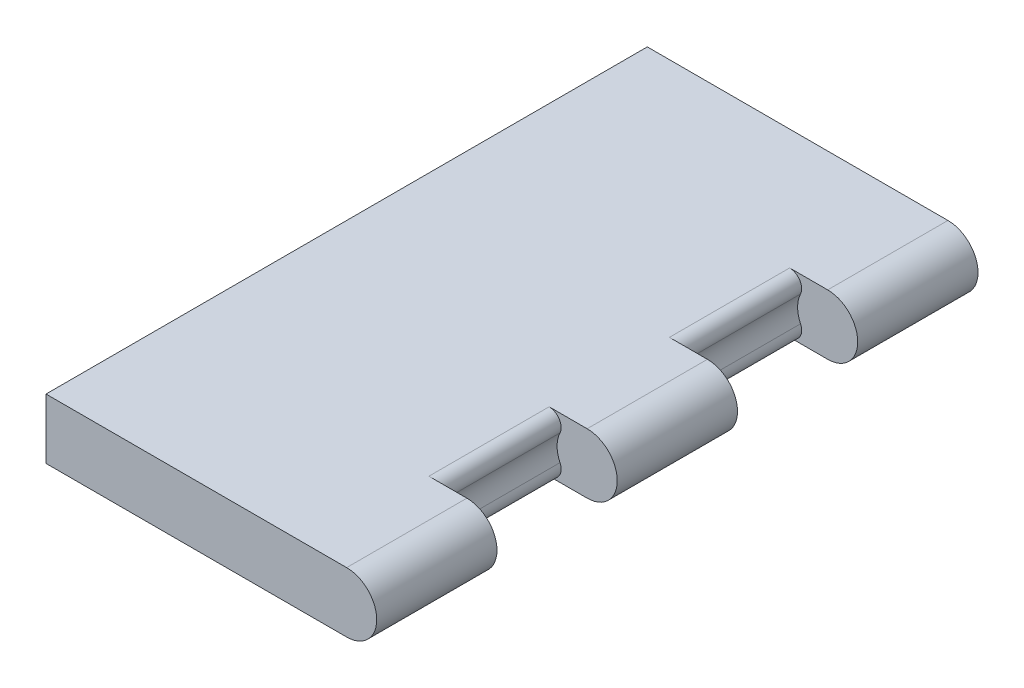
ISO-10303-21;
HEADER;
FILE_DESCRIPTION(('STEP AP214'),'2;1');
FILE_NAME('part.step','',(''),(''),'','','');
FILE_SCHEMA(('AUTOMOTIVE_DESIGN { 1 0 10303 214 1 1 1 1 }'));
ENDSEC;
DATA;
#1=APPLICATION_CONTEXT('core data for automotive mechanical design processes');
#2=APPLICATION_PROTOCOL_DEFINITION('international standard','automotive_design',2000,#1);
#3=PRODUCT_CONTEXT('',#1,'mechanical');
#4=PRODUCT('Part','Part','',(#3));
#5=PRODUCT_RELATED_PRODUCT_CATEGORY('part','',(#4));
#6=PRODUCT_DEFINITION_FORMATION('','',#4);
#7=PRODUCT_DEFINITION_CONTEXT('part definition',#1,'design');
#8=PRODUCT_DEFINITION('design','',#6,#7);
#9=PRODUCT_DEFINITION_SHAPE('','',#8);
#10=(LENGTH_UNIT() NAMED_UNIT(*) SI_UNIT(.MILLI.,.METRE.));
#11=(NAMED_UNIT(*) PLANE_ANGLE_UNIT() SI_UNIT($,.RADIAN.));
#12=(NAMED_UNIT(*) SI_UNIT($,.STERADIAN.) SOLID_ANGLE_UNIT());
#13=UNCERTAINTY_MEASURE_WITH_UNIT(LENGTH_MEASURE(1.E-05),#10,'distance_accuracy_value','');
#14=(GEOMETRIC_REPRESENTATION_CONTEXT(3) GLOBAL_UNCERTAINTY_ASSIGNED_CONTEXT((#13)) GLOBAL_UNIT_ASSIGNED_CONTEXT((#10,
#11,#12)) REPRESENTATION_CONTEXT('',''));
#15=CARTESIAN_POINT('',(0.,0.,0.));
#16=DIRECTION('',(0.,0.,1.));
#17=DIRECTION('',(1.,0.,0.));
#18=AXIS2_PLACEMENT_3D('',#15,#16,#17);
#19=CARTESIAN_POINT('',(50.,5.00000000000003,100.));
#20=DIRECTION('',(0.,0.,-1.));
#21=DIRECTION('',(-1.,0.,0.));
#22=AXIS2_PLACEMENT_3D('',#19,#20,#21);
#23=CYLINDRICAL_SURFACE('',#22,5.);
#24=CARTESIAN_POINT('',(50.,5.00000000000003,80.));
#25=DIRECTION('',(0.,0.,-1.));
#26=DIRECTION('',(-1.,0.,0.));
#27=AXIS2_PLACEMENT_3D('',#24,#25,#26);
#28=CIRCLE('',#27,5.);
#29=CARTESIAN_POINT('',(50.,0.,80.));
#30=VERTEX_POINT('',#29);
#31=CARTESIAN_POINT('',(50.,10.,80.));
#32=VERTEX_POINT('',#31);
#33=EDGE_CURVE('E263',#30,#32,#28,.F.);
#34=ORIENTED_EDGE('',*,*,#33,.T.);
#35=DIRECTION('',(0.,0.,-1.));
#36=VECTOR('',#35,1.);
#37=CARTESIAN_POINT('',(50.,10.,100.));
#38=LINE('',#37,#36);
#39=CARTESIAN_POINT('',(50.,10.,100.));
#40=VERTEX_POINT('',#39);
#41=EDGE_CURVE('E193',#40,#32,#38,.T.);
#42=ORIENTED_EDGE('',*,*,#41,.F.);
#43=CARTESIAN_POINT('',(50.,5.00000000000003,100.));
#44=DIRECTION('',(0.,0.,1.));
#45=DIRECTION('',(1.,0.,0.));
#46=AXIS2_PLACEMENT_3D('',#43,#44,#45);
#47=CIRCLE('',#46,5.);
#48=CARTESIAN_POINT('',(50.,0.,100.));
#49=VERTEX_POINT('',#48);
#50=EDGE_CURVE('E202',#49,#40,#47,.T.);
#51=ORIENTED_EDGE('',*,*,#50,.F.);
#52=DIRECTION('',(0.,0.,-1.));
#53=VECTOR('',#52,1.);
#54=CARTESIAN_POINT('',(50.,0.,100.));
#55=LINE('',#54,#53);
#56=EDGE_CURVE('E292',#49,#30,#55,.T.);
#57=ORIENTED_EDGE('',*,*,#56,.T.);
#58=EDGE_LOOP('',(#34,#42,#51,#57));
#59=FACE_BOUND('',#58,.T.);
#60=ADVANCED_FACE('F54',(#59),#23,.T.);
#61=CARTESIAN_POINT('',(50.,10.,60.));
#62=VERTEX_POINT('',#61);
#63=CARTESIAN_POINT('',(50.,10.,40.));
#64=VERTEX_POINT('',#63);
#65=EDGE_CURVE('E172',#62,#64,#38,.T.);
#66=ORIENTED_EDGE('',*,*,#65,.F.);
#67=CARTESIAN_POINT('',(50.,5.00000000000003,60.));
#68=DIRECTION('',(0.,0.,-1.));
#69=DIRECTION('',(-1.,0.,0.));
#70=AXIS2_PLACEMENT_3D('',#67,#68,#69);
#71=CIRCLE('',#70,5.);
#72=CARTESIAN_POINT('',(50.,0.,60.));
#73=VERTEX_POINT('',#72);
#74=EDGE_CURVE('E181',#62,#73,#71,.T.);
#75=ORIENTED_EDGE('',*,*,#74,.T.);
#76=CARTESIAN_POINT('',(50.,0.,40.));
#77=VERTEX_POINT('',#76);
#78=EDGE_CURVE('E295',#73,#77,#55,.T.);
#79=ORIENTED_EDGE('',*,*,#78,.T.);
#80=CARTESIAN_POINT('',(50.,5.00000000000003,40.));
#81=DIRECTION('',(0.,0.,-1.));
#82=DIRECTION('',(-1.,0.,0.));
#83=AXIS2_PLACEMENT_3D('',#80,#81,#82);
#84=CIRCLE('',#83,5.);
#85=EDGE_CURVE('E192',#77,#64,#84,.F.);
#86=ORIENTED_EDGE('',*,*,#85,.T.);
#87=EDGE_LOOP('',(#66,#75,#79,#86));
#88=FACE_BOUND('',#87,.T.);
#89=ADVANCED_FACE('F191',(#88),#23,.T.);
#90=CARTESIAN_POINT('',(0.,10.,100.));
#91=DIRECTION('',(0.,1.,0.));
#92=DIRECTION('',(-1.,0.,0.));
#93=AXIS2_PLACEMENT_3D('',#90,#91,#92);
#94=PLANE('',#93);
#95=DIRECTION('',(0.,0.,1.));
#96=VECTOR('',#95,1.);
#97=CARTESIAN_POINT('',(43.6754446796632,10.,60.));
#98=LINE('',#97,#96);
#99=CARTESIAN_POINT('',(43.6754446796632,10.,80.));
#100=VERTEX_POINT('',#99);
#101=CARTESIAN_POINT('',(43.6754446796632,10.,60.));
#102=VERTEX_POINT('',#101);
#103=EDGE_CURVE('E176',#100,#102,#98,.F.);
#104=ORIENTED_EDGE('',*,*,#103,.T.);
#105=DIRECTION('',(1.,0.,0.));
#106=VECTOR('',#105,1.);
#107=CARTESIAN_POINT('',(50.,10.,60.));
#108=LINE('',#107,#106);
#109=EDGE_CURVE('E168',#102,#62,#108,.T.);
#110=ORIENTED_EDGE('',*,*,#109,.T.);
#111=ORIENTED_EDGE('',*,*,#65,.T.);
#112=DIRECTION('',(-1.,0.,0.));
#113=VECTOR('',#112,1.);
#114=CARTESIAN_POINT('',(0.,10.,40.));
#115=LINE('',#114,#113);
#116=CARTESIAN_POINT('',(43.6754446796632,10.,40.));
#117=VERTEX_POINT('',#116);
#118=EDGE_CURVE('E68',#64,#117,#115,.T.);
#119=ORIENTED_EDGE('',*,*,#118,.T.);
#120=DIRECTION('',(0.,0.,1.));
#121=VECTOR('',#120,1.);
#122=CARTESIAN_POINT('',(43.6754446796632,10.,20.));
#123=LINE('',#122,#121);
#124=CARTESIAN_POINT('',(43.6754446796632,10.,20.));
#125=VERTEX_POINT('',#124);
#126=EDGE_CURVE('E226',#117,#125,#123,.F.);
#127=ORIENTED_EDGE('',*,*,#126,.T.);
#128=DIRECTION('',(1.,0.,0.));
#129=VECTOR('',#128,1.);
#130=CARTESIAN_POINT('',(50.,10.,20.));
#131=LINE('',#130,#129);
#132=CARTESIAN_POINT('',(50.,10.,20.));
#133=VERTEX_POINT('',#132);
#134=EDGE_CURVE('E229',#125,#133,#131,.T.);
#135=ORIENTED_EDGE('',*,*,#134,.T.);
#136=CARTESIAN_POINT('',(50.,10.,0.));
#137=VERTEX_POINT('',#136);
#138=EDGE_CURVE('E194',#133,#137,#38,.T.);
#139=ORIENTED_EDGE('',*,*,#138,.T.);
#140=DIRECTION('',(1.,0.,0.));
#141=VECTOR('',#140,1.);
#142=CARTESIAN_POINT('',(0.,10.,0.));
#143=LINE('',#142,#141);
#144=CARTESIAN_POINT('',(0.,10.,0.));
#145=VERTEX_POINT('',#144);
#146=EDGE_CURVE('E205',#145,#137,#143,.T.);
#147=ORIENTED_EDGE('',*,*,#146,.F.);
#148=DIRECTION('',(0.,0.,-1.));
#149=VECTOR('',#148,1.);
#150=CARTESIAN_POINT('',(0.,10.,100.));
#151=LINE('',#150,#149);
#152=CARTESIAN_POINT('',(0.,10.,100.));
#153=VERTEX_POINT('',#152);
#154=EDGE_CURVE('E198',#153,#145,#151,.T.);
#155=ORIENTED_EDGE('',*,*,#154,.F.);
#156=DIRECTION('',(1.,0.,0.));
#157=VECTOR('',#156,1.);
#158=CARTESIAN_POINT('',(0.,10.,100.));
#159=LINE('',#158,#157);
#160=EDGE_CURVE('E291',#153,#40,#159,.T.);
#161=ORIENTED_EDGE('',*,*,#160,.T.);
#162=ORIENTED_EDGE('',*,*,#41,.T.);
#163=DIRECTION('',(-1.,0.,0.));
#164=VECTOR('',#163,1.);
#165=CARTESIAN_POINT('',(0.,10.,80.));
#166=LINE('',#165,#164);
#167=EDGE_CURVE('E231',#32,#100,#166,.T.);
#168=ORIENTED_EDGE('',*,*,#167,.T.);
#169=EDGE_LOOP('',(#104,#110,#111,#119,#127,#135,#139,#147,#155,#161,#162,#168));
#170=FACE_BOUND('',#169,.T.);
#171=ADVANCED_FACE('F170',(#170),#94,.T.);
#172=CARTESIAN_POINT('',(0.,0.,100.));
#173=DIRECTION('',(-1.,0.,0.));
#174=DIRECTION('',(0.,-1.,0.));
#175=AXIS2_PLACEMENT_3D('',#172,#173,#174);
#176=PLANE('',#175);
#177=DIRECTION('',(0.,1.,0.));
#178=VECTOR('',#177,1.);
#179=CARTESIAN_POINT('',(0.,0.,0.));
#180=LINE('',#179,#178);
#181=CARTESIAN_POINT('',(0.,0.,0.));
#182=VERTEX_POINT('',#181);
#183=EDGE_CURVE('E282',#182,#145,#180,.T.);
#184=ORIENTED_EDGE('',*,*,#183,.F.);
#185=DIRECTION('',(0.,0.,-1.));
#186=VECTOR('',#185,1.);
#187=CARTESIAN_POINT('',(0.,0.,100.));
#188=LINE('',#187,#186);
#189=CARTESIAN_POINT('',(0.,0.,100.));
#190=VERTEX_POINT('',#189);
#191=EDGE_CURVE('E294',#190,#182,#188,.T.);
#192=ORIENTED_EDGE('',*,*,#191,.F.);
#193=DIRECTION('',(0.,1.,0.));
#194=VECTOR('',#193,1.);
#195=CARTESIAN_POINT('',(0.,0.,100.));
#196=LINE('',#195,#194);
#197=EDGE_CURVE('E302',#190,#153,#196,.T.);
#198=ORIENTED_EDGE('',*,*,#197,.T.);
#199=ORIENTED_EDGE('',*,*,#154,.T.);
#200=EDGE_LOOP('',(#184,#192,#198,#199));
#201=FACE_BOUND('',#200,.T.);
#202=ADVANCED_FACE('F300',(#201),#176,.T.);
#203=CARTESIAN_POINT('',(0.,0.,100.));
#204=DIRECTION('',(0.,1.,0.));
#205=DIRECTION('',(-1.,0.,0.));
#206=AXIS2_PLACEMENT_3D('',#203,#204,#205);
#207=PLANE('',#206);
#208=ORIENTED_EDGE('',*,*,#78,.F.);
#209=DIRECTION('',(-1.,0.,0.));
#210=VECTOR('',#209,1.);
#211=CARTESIAN_POINT('',(0.,0.,60.));
#212=LINE('',#211,#210);
#213=CARTESIAN_POINT('',(43.6754446796633,0.,60.));
#214=VERTEX_POINT('',#213);
#215=EDGE_CURVE('E184',#73,#214,#212,.T.);
#216=ORIENTED_EDGE('',*,*,#215,.T.);
#217=DIRECTION('',(0.,0.,-1.));
#218=VECTOR('',#217,1.);
#219=CARTESIAN_POINT('',(43.6754446796633,0.,100.));
#220=LINE('',#219,#218);
#221=CARTESIAN_POINT('',(43.6754446796633,0.,80.));
#222=VERTEX_POINT('',#221);
#223=EDGE_CURVE('E221',#214,#222,#220,.F.);
#224=ORIENTED_EDGE('',*,*,#223,.T.);
#225=DIRECTION('',(1.,0.,0.));
#226=VECTOR('',#225,1.);
#227=CARTESIAN_POINT('',(0.,0.,80.));
#228=LINE('',#227,#226);
#229=EDGE_CURVE('E219',#222,#30,#228,.T.);
#230=ORIENTED_EDGE('',*,*,#229,.T.);
#231=ORIENTED_EDGE('',*,*,#56,.F.);
#232=DIRECTION('',(1.,0.,0.));
#233=VECTOR('',#232,1.);
#234=CARTESIAN_POINT('',(0.,0.,100.));
#235=LINE('',#234,#233);
#236=EDGE_CURVE('E287',#190,#49,#235,.T.);
#237=ORIENTED_EDGE('',*,*,#236,.F.);
#238=ORIENTED_EDGE('',*,*,#191,.T.);
#239=DIRECTION('',(1.,0.,0.));
#240=VECTOR('',#239,1.);
#241=CARTESIAN_POINT('',(0.,0.,0.));
#242=LINE('',#241,#240);
#243=CARTESIAN_POINT('',(50.,0.,0.));
#244=VERTEX_POINT('',#243);
#245=EDGE_CURVE('E284',#182,#244,#242,.T.);
#246=ORIENTED_EDGE('',*,*,#245,.T.);
#247=CARTESIAN_POINT('',(50.,0.,20.));
#248=VERTEX_POINT('',#247);
#249=EDGE_CURVE('E275',#248,#244,#55,.T.);
#250=ORIENTED_EDGE('',*,*,#249,.F.);
#251=DIRECTION('',(-1.,0.,0.));
#252=VECTOR('',#251,1.);
#253=CARTESIAN_POINT('',(0.,0.,20.));
#254=LINE('',#253,#252);
#255=CARTESIAN_POINT('',(43.6754446796633,0.,20.));
#256=VERTEX_POINT('',#255);
#257=EDGE_CURVE('E76',#248,#256,#254,.T.);
#258=ORIENTED_EDGE('',*,*,#257,.T.);
#259=DIRECTION('',(0.,0.,-1.));
#260=VECTOR('',#259,1.);
#261=CARTESIAN_POINT('',(43.6754446796633,0.,100.));
#262=LINE('',#261,#260);
#263=CARTESIAN_POINT('',(43.6754446796633,0.,40.));
#264=VERTEX_POINT('',#263);
#265=EDGE_CURVE('E215',#256,#264,#262,.F.);
#266=ORIENTED_EDGE('',*,*,#265,.T.);
#267=DIRECTION('',(1.,0.,0.));
#268=VECTOR('',#267,1.);
#269=CARTESIAN_POINT('',(0.,0.,40.));
#270=LINE('',#269,#268);
#271=EDGE_CURVE('E213',#264,#77,#270,.T.);
#272=ORIENTED_EDGE('',*,*,#271,.T.);
#273=EDGE_LOOP('',(#208,#216,#224,#230,#231,#237,#238,#246,#250,#258,#266,#272));
#274=FACE_BOUND('',#273,.T.);
#275=ADVANCED_FACE('F329',(#274),#207,.F.);
#276=CARTESIAN_POINT('',(0.,0.,0.));
#277=DIRECTION('',(0.,0.,1.));
#278=DIRECTION('',(1.,0.,0.));
#279=AXIS2_PLACEMENT_3D('',#276,#277,#278);
#280=PLANE('',#279);
#281=ORIENTED_EDGE('',*,*,#146,.T.);
#282=CARTESIAN_POINT('',(50.,5.00000000000003,0.));
#283=DIRECTION('',(0.,0.,1.));
#284=DIRECTION('',(1.,0.,0.));
#285=AXIS2_PLACEMENT_3D('',#282,#283,#284);
#286=CIRCLE('',#285,5.);
#287=EDGE_CURVE('E206',#244,#137,#286,.T.);
#288=ORIENTED_EDGE('',*,*,#287,.F.);
#289=ORIENTED_EDGE('',*,*,#245,.F.);
#290=ORIENTED_EDGE('',*,*,#183,.T.);
#291=EDGE_LOOP('',(#281,#288,#289,#290));
#292=FACE_BOUND('',#291,.T.);
#293=ADVANCED_FACE('F280',(#292),#280,.F.);
#294=CARTESIAN_POINT('',(0.,0.,100.));
#295=DIRECTION('',(0.,0.,1.));
#296=DIRECTION('',(1.,0.,0.));
#297=AXIS2_PLACEMENT_3D('',#294,#295,#296);
#298=PLANE('',#297);
#299=ORIENTED_EDGE('',*,*,#236,.T.);
#300=ORIENTED_EDGE('',*,*,#50,.T.);
#301=ORIENTED_EDGE('',*,*,#160,.F.);
#302=ORIENTED_EDGE('',*,*,#197,.F.);
#303=EDGE_LOOP('',(#299,#300,#301,#302));
#304=FACE_BOUND('',#303,.T.);
#305=ADVANCED_FACE('F307',(#304),#298,.T.);
#306=ORIENTED_EDGE('',*,*,#138,.F.);
#307=CARTESIAN_POINT('',(50.,5.00000000000003,20.));
#308=DIRECTION('',(0.,0.,-1.));
#309=DIRECTION('',(-1.,0.,0.));
#310=AXIS2_PLACEMENT_3D('',#307,#308,#309);
#311=CIRCLE('',#310,5.);
#312=EDGE_CURVE('E262',#133,#248,#311,.T.);
#313=ORIENTED_EDGE('',*,*,#312,.T.);
#314=ORIENTED_EDGE('',*,*,#249,.T.);
#315=ORIENTED_EDGE('',*,*,#287,.T.);
#316=EDGE_LOOP('',(#306,#313,#314,#315));
#317=FACE_BOUND('',#316,.T.);
#318=ADVANCED_FACE('F272',(#317),#23,.T.);
#319=CARTESIAN_POINT('',(50.,5.00000000000003,54.142135623731));
#320=DIRECTION('',(0.,0.,-1.));
#321=DIRECTION('',(-1.,0.,0.));
#322=AXIS2_PLACEMENT_3D('',#319,#320,#321);
#323=CYLINDRICAL_SURFACE('',#322,5.);
#324=CARTESIAN_POINT('',(45.4824604854737,7.14285714285717,40.));
#325=VERTEX_POINT('',#324);
#326=CARTESIAN_POINT('',(45.4824604854738,2.85714285714288,40.));
#327=VERTEX_POINT('',#326);
#328=EDGE_CURVE('E267',#325,#327,#84,.F.);
#329=ORIENTED_EDGE('',*,*,#328,.T.);
#330=DIRECTION('',(0.,0.,-1.));
#331=VECTOR('',#330,1.);
#332=CARTESIAN_POINT('',(45.4824604854738,2.85714285714288,54.142135623731));
#333=LINE('',#332,#331);
#334=CARTESIAN_POINT('',(45.4824604854738,2.85714285714288,20.));
#335=VERTEX_POINT('',#334);
#336=EDGE_CURVE('E235',#327,#335,#333,.T.);
#337=ORIENTED_EDGE('',*,*,#336,.T.);
#338=CARTESIAN_POINT('',(45.4824604854737,7.14285714285717,20.));
#339=VERTEX_POINT('',#338);
#340=EDGE_CURVE('E253',#335,#339,#311,.T.);
#341=ORIENTED_EDGE('',*,*,#340,.T.);
#342=DIRECTION('',(0.,0.,-1.));
#343=VECTOR('',#342,1.);
#344=CARTESIAN_POINT('',(45.4824604854737,7.14285714285717,54.142135623731));
#345=LINE('',#344,#343);
#346=EDGE_CURVE('E178',#339,#325,#345,.F.);
#347=ORIENTED_EDGE('',*,*,#346,.T.);
#348=EDGE_LOOP('',(#329,#337,#341,#347));
#349=FACE_BOUND('',#348,.T.);
#350=ADVANCED_FACE('F259',(#349),#323,.F.);
#351=CARTESIAN_POINT('',(50.,5.00000000000003,20.));
#352=DIRECTION('',(0.,0.,-1.));
#353=DIRECTION('',(-1.,0.,0.));
#354=AXIS2_PLACEMENT_3D('',#351,#352,#353);
#355=PLANE('',#354);
#356=ORIENTED_EDGE('',*,*,#312,.F.);
#357=ORIENTED_EDGE('',*,*,#134,.F.);
#358=CARTESIAN_POINT('',(43.6754446796632,8.00000000000003,20.));
#359=DIRECTION('',(0.,0.,-1.));
#360=DIRECTION('',(-1.,0.,0.));
#361=AXIS2_PLACEMENT_3D('',#358,#359,#360);
#362=CIRCLE('',#361,2.);
#363=EDGE_CURVE('E62',#125,#339,#362,.T.);
#364=ORIENTED_EDGE('',*,*,#363,.T.);
#365=ORIENTED_EDGE('',*,*,#340,.F.);
#366=CARTESIAN_POINT('',(43.6754446796633,2.00000000000002,20.));
#367=DIRECTION('',(0.,0.,-1.));
#368=DIRECTION('',(-1.,0.,0.));
#369=AXIS2_PLACEMENT_3D('',#366,#367,#368);
#370=CIRCLE('',#369,2.);
#371=EDGE_CURVE('E246',#335,#256,#370,.T.);
#372=ORIENTED_EDGE('',*,*,#371,.T.);
#373=ORIENTED_EDGE('',*,*,#257,.F.);
#374=EDGE_LOOP('',(#356,#357,#364,#365,#372,#373));
#375=FACE_BOUND('',#374,.T.);
#376=ADVANCED_FACE('F252',(#375),#355,.F.);
#377=CARTESIAN_POINT('',(0.,0.,40.));
#378=DIRECTION('',(0.,0.,-1.));
#379=DIRECTION('',(-1.,0.,0.));
#380=AXIS2_PLACEMENT_3D('',#377,#378,#379);
#381=PLANE('',#380);
#382=ORIENTED_EDGE('',*,*,#85,.F.);
#383=ORIENTED_EDGE('',*,*,#271,.F.);
#384=CARTESIAN_POINT('',(43.6754446796633,2.00000000000002,40.));
#385=DIRECTION('',(0.,0.,-1.));
#386=DIRECTION('',(-1.,0.,0.));
#387=AXIS2_PLACEMENT_3D('',#384,#385,#386);
#388=CIRCLE('',#387,2.);
#389=EDGE_CURVE('E248',#264,#327,#388,.F.);
#390=ORIENTED_EDGE('',*,*,#389,.T.);
#391=ORIENTED_EDGE('',*,*,#328,.F.);
#392=CARTESIAN_POINT('',(43.6754446796632,8.00000000000003,40.));
#393=DIRECTION('',(0.,0.,-1.));
#394=DIRECTION('',(-1.,0.,0.));
#395=AXIS2_PLACEMENT_3D('',#392,#393,#394);
#396=CIRCLE('',#395,2.);
#397=EDGE_CURVE('E12',#325,#117,#396,.F.);
#398=ORIENTED_EDGE('',*,*,#397,.T.);
#399=ORIENTED_EDGE('',*,*,#118,.F.);
#400=EDGE_LOOP('',(#382,#383,#390,#391,#398,#399));
#401=FACE_BOUND('',#400,.T.);
#402=ADVANCED_FACE('F266',(#401),#381,.T.);
#403=CARTESIAN_POINT('',(50.,5.00000000000003,94.1421356237309));
#404=DIRECTION('',(0.,0.,-1.));
#405=DIRECTION('',(-1.,0.,0.));
#406=AXIS2_PLACEMENT_3D('',#403,#404,#405);
#407=CYLINDRICAL_SURFACE('',#406,5.);
#408=CARTESIAN_POINT('',(45.4824604854737,7.14285714285717,80.));
#409=VERTEX_POINT('',#408);
#410=CARTESIAN_POINT('',(45.4824604854738,2.85714285714288,80.));
#411=VERTEX_POINT('',#410);
#412=EDGE_CURVE('E188',#409,#411,#28,.F.);
#413=ORIENTED_EDGE('',*,*,#412,.T.);
#414=DIRECTION('',(0.,0.,-1.));
#415=VECTOR('',#414,1.);
#416=CARTESIAN_POINT('',(45.4824604854738,2.85714285714288,94.1421356237309));
#417=LINE('',#416,#415);
#418=CARTESIAN_POINT('',(45.4824604854738,2.85714285714288,60.));
#419=VERTEX_POINT('',#418);
#420=EDGE_CURVE('E210',#411,#419,#417,.T.);
#421=ORIENTED_EDGE('',*,*,#420,.T.);
#422=CARTESIAN_POINT('',(45.4824604854737,7.14285714285717,60.));
#423=VERTEX_POINT('',#422);
#424=EDGE_CURVE('E189',#419,#423,#71,.T.);
#425=ORIENTED_EDGE('',*,*,#424,.T.);
#426=DIRECTION('',(0.,0.,-1.));
#427=VECTOR('',#426,1.);
#428=CARTESIAN_POINT('',(45.4824604854737,7.14285714285717,94.1421356237309));
#429=LINE('',#428,#427);
#430=EDGE_CURVE('E197',#423,#409,#429,.F.);
#431=ORIENTED_EDGE('',*,*,#430,.T.);
#432=EDGE_LOOP('',(#413,#421,#425,#431));
#433=FACE_BOUND('',#432,.T.);
#434=ADVANCED_FACE('F319',(#433),#407,.F.);
#435=CARTESIAN_POINT('',(50.,5.00000000000003,60.));
#436=DIRECTION('',(0.,0.,-1.));
#437=DIRECTION('',(-1.,0.,0.));
#438=AXIS2_PLACEMENT_3D('',#435,#436,#437);
#439=PLANE('',#438);
#440=ORIENTED_EDGE('',*,*,#74,.F.);
#441=ORIENTED_EDGE('',*,*,#109,.F.);
#442=CARTESIAN_POINT('',(43.6754446796632,8.00000000000003,60.));
#443=DIRECTION('',(0.,0.,-1.));
#444=DIRECTION('',(-1.,0.,0.));
#445=AXIS2_PLACEMENT_3D('',#442,#443,#444);
#446=CIRCLE('',#445,2.);
#447=EDGE_CURVE('E242',#102,#423,#446,.T.);
#448=ORIENTED_EDGE('',*,*,#447,.T.);
#449=ORIENTED_EDGE('',*,*,#424,.F.);
#450=CARTESIAN_POINT('',(43.6754446796633,2.00000000000002,60.));
#451=DIRECTION('',(0.,0.,-1.));
#452=DIRECTION('',(-1.,0.,0.));
#453=AXIS2_PLACEMENT_3D('',#450,#451,#452);
#454=CIRCLE('',#453,2.);
#455=EDGE_CURVE('E238',#419,#214,#454,.T.);
#456=ORIENTED_EDGE('',*,*,#455,.T.);
#457=ORIENTED_EDGE('',*,*,#215,.F.);
#458=EDGE_LOOP('',(#440,#441,#448,#449,#456,#457));
#459=FACE_BOUND('',#458,.T.);
#460=ADVANCED_FACE('F182',(#459),#439,.F.);
#461=CARTESIAN_POINT('',(0.,0.,80.));
#462=DIRECTION('',(0.,0.,-1.));
#463=DIRECTION('',(-1.,0.,0.));
#464=AXIS2_PLACEMENT_3D('',#461,#462,#463);
#465=PLANE('',#464);
#466=ORIENTED_EDGE('',*,*,#33,.F.);
#467=ORIENTED_EDGE('',*,*,#229,.F.);
#468=CARTESIAN_POINT('',(43.6754446796633,2.00000000000002,80.));
#469=DIRECTION('',(0.,0.,-1.));
#470=DIRECTION('',(-1.,0.,0.));
#471=AXIS2_PLACEMENT_3D('',#468,#469,#470);
#472=CIRCLE('',#471,2.);
#473=EDGE_CURVE('E240',#222,#411,#472,.F.);
#474=ORIENTED_EDGE('',*,*,#473,.T.);
#475=ORIENTED_EDGE('',*,*,#412,.F.);
#476=CARTESIAN_POINT('',(43.6754446796632,8.00000000000003,80.));
#477=DIRECTION('',(0.,0.,-1.));
#478=DIRECTION('',(-1.,0.,0.));
#479=AXIS2_PLACEMENT_3D('',#476,#477,#478);
#480=CIRCLE('',#479,2.);
#481=EDGE_CURVE('E244',#409,#100,#480,.F.);
#482=ORIENTED_EDGE('',*,*,#481,.T.);
#483=ORIENTED_EDGE('',*,*,#167,.F.);
#484=EDGE_LOOP('',(#466,#467,#474,#475,#482,#483));
#485=FACE_BOUND('',#484,.T.);
#486=ADVANCED_FACE('F332',(#485),#465,.T.);
#487=CARTESIAN_POINT('',(43.6754446796633,2.00000000000002,94.1421356237309));
#488=DIRECTION('',(0.,0.,-1.));
#489=DIRECTION('',(-1.,0.,0.));
#490=AXIS2_PLACEMENT_3D('',#487,#488,#489);
#491=CYLINDRICAL_SURFACE('',#490,2.);
#492=ORIENTED_EDGE('',*,*,#473,.F.);
#493=ORIENTED_EDGE('',*,*,#223,.F.);
#494=ORIENTED_EDGE('',*,*,#455,.F.);
#495=ORIENTED_EDGE('',*,*,#420,.F.);
#496=EDGE_LOOP('',(#492,#493,#494,#495));
#497=FACE_BOUND('',#496,.T.);
#498=ADVANCED_FACE('F327',(#497),#491,.T.);
#499=CARTESIAN_POINT('',(43.6754446796632,8.00000000000003,94.1421356237309));
#500=DIRECTION('',(0.,0.,-1.));
#501=DIRECTION('',(-1.,0.,0.));
#502=AXIS2_PLACEMENT_3D('',#499,#500,#501);
#503=CYLINDRICAL_SURFACE('',#502,2.);
#504=ORIENTED_EDGE('',*,*,#481,.F.);
#505=ORIENTED_EDGE('',*,*,#430,.F.);
#506=ORIENTED_EDGE('',*,*,#447,.F.);
#507=ORIENTED_EDGE('',*,*,#103,.F.);
#508=EDGE_LOOP('',(#504,#505,#506,#507));
#509=FACE_BOUND('',#508,.T.);
#510=ADVANCED_FACE('F331',(#509),#503,.T.);
#511=CARTESIAN_POINT('',(43.6754446796633,2.00000000000002,54.142135623731));
#512=DIRECTION('',(0.,0.,-1.));
#513=DIRECTION('',(-1.,0.,0.));
#514=AXIS2_PLACEMENT_3D('',#511,#512,#513);
#515=CYLINDRICAL_SURFACE('',#514,2.);
#516=ORIENTED_EDGE('',*,*,#389,.F.);
#517=ORIENTED_EDGE('',*,*,#265,.F.);
#518=ORIENTED_EDGE('',*,*,#371,.F.);
#519=ORIENTED_EDGE('',*,*,#336,.F.);
#520=EDGE_LOOP('',(#516,#517,#518,#519));
#521=FACE_BOUND('',#520,.T.);
#522=ADVANCED_FACE('F459',(#521),#515,.T.);
#523=CARTESIAN_POINT('',(43.6754446796632,8.00000000000003,54.142135623731));
#524=DIRECTION('',(0.,0.,-1.));
#525=DIRECTION('',(-1.,0.,0.));
#526=AXIS2_PLACEMENT_3D('',#523,#524,#525);
#527=CYLINDRICAL_SURFACE('',#526,2.);
#528=ORIENTED_EDGE('',*,*,#397,.F.);
#529=ORIENTED_EDGE('',*,*,#346,.F.);
#530=ORIENTED_EDGE('',*,*,#363,.F.);
#531=ORIENTED_EDGE('',*,*,#126,.F.);
#532=EDGE_LOOP('',(#528,#529,#530,#531));
#533=FACE_BOUND('',#532,.T.);
#534=ADVANCED_FACE('F56',(#533),#527,.T.);
#535=CLOSED_SHELL('',(#60,#89,#171,#202,#275,#293,#305,#318,#350,#376,#402,#434,#460,#486,#498,
#510,#522,#534));
#536=MANIFOLD_SOLID_BREP('B2',#535);
#537=ADVANCED_BREP_SHAPE_REPRESENTATION('',(#18,#536),#14);
#538=SHAPE_DEFINITION_REPRESENTATION(#9,#537);
ENDSEC;
END-ISO-10303-21;
